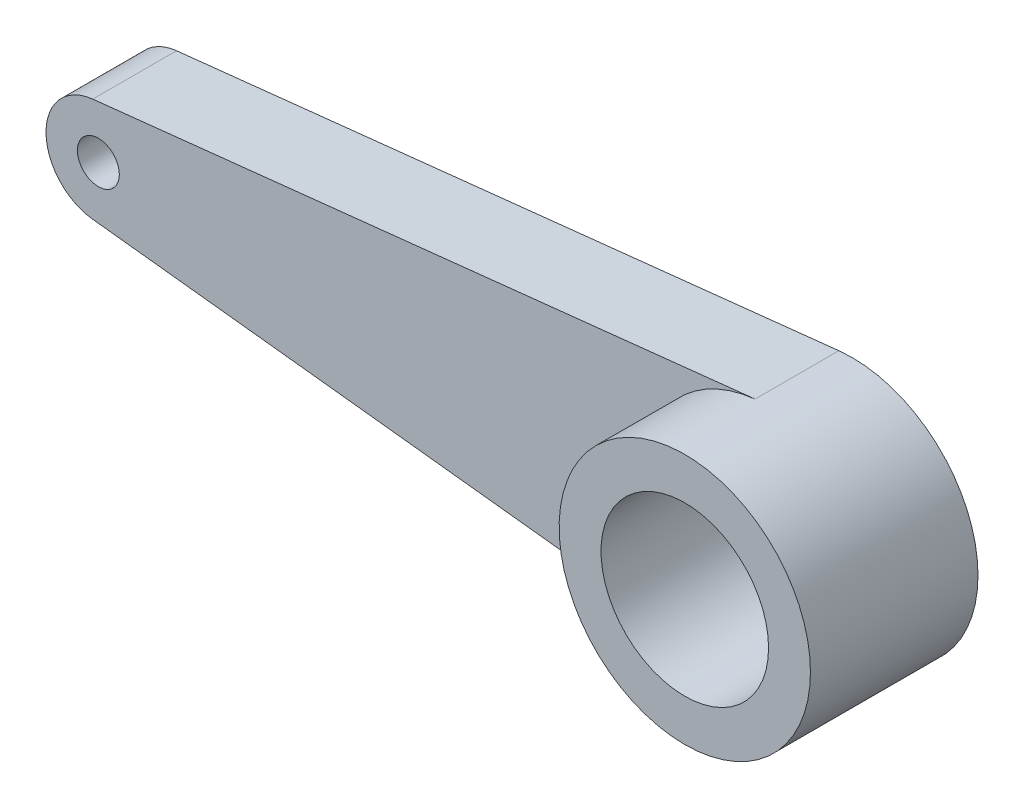
ISO-10303-21;
HEADER;
FILE_DESCRIPTION(('STEP AP214'),'2;1');
FILE_NAME('part.step','',(''),(''),'','','');
FILE_SCHEMA(('AUTOMOTIVE_DESIGN { 1 0 10303 214 1 1 1 1 }'));
ENDSEC;
DATA;
#1=APPLICATION_CONTEXT('core data for automotive mechanical design processes');
#2=APPLICATION_PROTOCOL_DEFINITION('international standard','automotive_design',2000,#1);
#3=PRODUCT_CONTEXT('',#1,'mechanical');
#4=PRODUCT('Part','Part','',(#3));
#5=PRODUCT_RELATED_PRODUCT_CATEGORY('part','',(#4));
#6=PRODUCT_DEFINITION_FORMATION('','',#4);
#7=PRODUCT_DEFINITION_CONTEXT('part definition',#1,'design');
#8=PRODUCT_DEFINITION('design','',#6,#7);
#9=PRODUCT_DEFINITION_SHAPE('','',#8);
#10=(LENGTH_UNIT() NAMED_UNIT(*) SI_UNIT(.MILLI.,.METRE.));
#11=(NAMED_UNIT(*) PLANE_ANGLE_UNIT() SI_UNIT($,.RADIAN.));
#12=(NAMED_UNIT(*) SI_UNIT($,.STERADIAN.) SOLID_ANGLE_UNIT());
#13=UNCERTAINTY_MEASURE_WITH_UNIT(LENGTH_MEASURE(1.E-05),#10,'distance_accuracy_value','');
#14=(GEOMETRIC_REPRESENTATION_CONTEXT(3) GLOBAL_UNCERTAINTY_ASSIGNED_CONTEXT((#13)) GLOBAL_UNIT_ASSIGNED_CONTEXT((#10,
#11,#12)) REPRESENTATION_CONTEXT('',''));
#15=CARTESIAN_POINT('',(0.,0.,0.));
#16=DIRECTION('',(0.,0.,1.));
#17=DIRECTION('',(1.,0.,0.));
#18=AXIS2_PLACEMENT_3D('',#15,#16,#17);
#19=CARTESIAN_POINT('',(0.,0.,4.));
#20=DIRECTION('',(0.,0.,-1.));
#21=DIRECTION('',(-1.,0.,0.));
#22=AXIS2_PLACEMENT_3D('',#19,#20,#21);
#23=CYLINDRICAL_SURFACE('',#22,3.);
#24=CARTESIAN_POINT('',(0.,0.,4.));
#25=DIRECTION('',(0.,0.,1.));
#26=DIRECTION('',(1.,0.,0.));
#27=AXIS2_PLACEMENT_3D('',#24,#25,#26);
#28=CIRCLE('',#27,3.);
#29=CARTESIAN_POINT('',(3.,0.,4.));
#30=VERTEX_POINT('',#29);
#31=EDGE_CURVE('E11',#30,#30,#28,.T.);
#32=ORIENTED_EDGE('',*,*,#31,.F.);
#33=EDGE_LOOP('',(#32));
#34=FACE_BOUND('',#33,.T.);
#35=DIRECTION('',(0.,0.,-1.));
#36=VECTOR('',#35,1.);
#37=CARTESIAN_POINT('',(-0.321491523372577,2.98272412408516,2.));
#38=LINE('',#37,#36);
#39=CARTESIAN_POINT('',(-0.321491523372577,2.98272412408516,2.));
#40=VERTEX_POINT('',#39);
#41=CARTESIAN_POINT('',(-0.321491523372577,2.98272412408516,0.));
#42=VERTEX_POINT('',#41);
#43=EDGE_CURVE('E62',#40,#42,#38,.T.);
#44=ORIENTED_EDGE('',*,*,#43,.F.);
#45=CARTESIAN_POINT('',(0.,0.,2.));
#46=DIRECTION('',(0.,0.,1.));
#47=DIRECTION('',(1.,0.,0.));
#48=AXIS2_PLACEMENT_3D('',#45,#46,#47);
#49=CIRCLE('',#48,3.);
#50=CARTESIAN_POINT('',(-0.334755230815125,-2.98126465370686,2.));
#51=VERTEX_POINT('',#50);
#52=EDGE_CURVE('E57',#40,#51,#49,.T.);
#53=ORIENTED_EDGE('',*,*,#52,.T.);
#54=DIRECTION('',(0.,0.,-1.));
#55=VECTOR('',#54,1.);
#56=CARTESIAN_POINT('',(-0.334755230815125,-2.98126465370686,2.));
#57=LINE('',#56,#55);
#58=CARTESIAN_POINT('',(-0.334755230815125,-2.98126465370686,0.));
#59=VERTEX_POINT('',#58);
#60=EDGE_CURVE('E132',#51,#59,#57,.T.);
#61=ORIENTED_EDGE('',*,*,#60,.T.);
#62=CARTESIAN_POINT('',(0.,0.,0.));
#63=DIRECTION('',(0.,0.,1.));
#64=DIRECTION('',(1.,0.,0.));
#65=AXIS2_PLACEMENT_3D('',#62,#63,#64);
#66=CIRCLE('',#65,3.);
#67=EDGE_CURVE('E43',#59,#42,#66,.T.);
#68=ORIENTED_EDGE('',*,*,#67,.T.);
#69=EDGE_LOOP('',(#44,#53,#61,#68));
#70=FACE_BOUND('',#69,.T.);
#71=ADVANCED_FACE('F39',(#34,#70),#23,.T.);
#72=CARTESIAN_POINT('',(0.,0.,4.));
#73=DIRECTION('',(0.,0.,-1.));
#74=DIRECTION('',(-1.,0.,0.));
#75=AXIS2_PLACEMENT_3D('',#72,#73,#74);
#76=CYLINDRICAL_SURFACE('',#75,2.);
#77=CARTESIAN_POINT('',(0.,0.,4.));
#78=DIRECTION('',(0.,0.,1.));
#79=DIRECTION('',(1.,0.,0.));
#80=AXIS2_PLACEMENT_3D('',#77,#78,#79);
#81=CIRCLE('',#80,2.);
#82=CARTESIAN_POINT('',(2.,0.,4.));
#83=VERTEX_POINT('',#82);
#84=EDGE_CURVE('E49',#83,#83,#81,.T.);
#85=ORIENTED_EDGE('',*,*,#84,.T.);
#86=EDGE_LOOP('',(#85));
#87=FACE_BOUND('',#86,.T.);
#88=CARTESIAN_POINT('',(0.,0.,0.));
#89=DIRECTION('',(0.,0.,1.));
#90=DIRECTION('',(1.,0.,0.));
#91=AXIS2_PLACEMENT_3D('',#88,#89,#90);
#92=CIRCLE('',#91,2.);
#93=CARTESIAN_POINT('',(2.,0.,0.));
#94=VERTEX_POINT('',#93);
#95=EDGE_CURVE('E93',#94,#94,#92,.T.);
#96=ORIENTED_EDGE('',*,*,#95,.F.);
#97=EDGE_LOOP('',(#96));
#98=FACE_BOUND('',#97,.T.);
#99=ADVANCED_FACE('F41',(#87,#98),#76,.F.);
#100=CARTESIAN_POINT('',(0.,0.,4.));
#101=DIRECTION('',(0.,0.,1.));
#102=DIRECTION('',(1.,0.,0.));
#103=AXIS2_PLACEMENT_3D('',#100,#101,#102);
#104=PLANE('',#103);
#105=ORIENTED_EDGE('',*,*,#84,.F.);
#106=EDGE_LOOP('',(#105));
#107=FACE_BOUND('',#106,.T.);
#108=ORIENTED_EDGE('',*,*,#31,.T.);
#109=EDGE_LOOP('',(#108));
#110=FACE_BOUND('',#109,.T.);
#111=ADVANCED_FACE('F166',(#107,#110),#104,.T.);
#112=CARTESIAN_POINT('',(0.,0.,0.));
#113=DIRECTION('',(0.,0.,1.));
#114=DIRECTION('',(1.,0.,0.));
#115=AXIS2_PLACEMENT_3D('',#112,#113,#114);
#116=PLANE('',#115);
#117=ORIENTED_EDGE('',*,*,#95,.T.);
#118=EDGE_LOOP('',(#117));
#119=FACE_BOUND('',#118,.T.);
#120=ORIENTED_EDGE('',*,*,#67,.F.);
#121=DIRECTION('',(0.993754884568955,-0.111585076938375,0.));
#122=VECTOR('',#121,1.);
#123=CARTESIAN_POINT('',(-0.334755230815125,-2.98126465370686,0.));
#124=LINE('',#123,#122);
#125=CARTESIAN_POINT('',(-16.139481346173,-1.20661015192084,0.));
#126=VERTEX_POINT('',#125);
#127=EDGE_CURVE('E111',#126,#59,#124,.T.);
#128=ORIENTED_EDGE('',*,*,#127,.F.);
#129=CARTESIAN_POINT('',(-16.,0.0355834537903587,0.));
#130=DIRECTION('',(0.,0.,1.));
#131=DIRECTION('',(1.,0.,0.));
#132=AXIS2_PLACEMENT_3D('',#129,#130,#131);
#133=CIRCLE('',#132,1.25);
#134=CARTESIAN_POINT('',(-16.1339548014052,1.27838517215917,0.));
#135=VERTEX_POINT('',#134);
#136=EDGE_CURVE('E124',#135,#126,#133,.T.);
#137=ORIENTED_EDGE('',*,*,#136,.F.);
#138=DIRECTION('',(0.994241374695053,0.107163841124192,0.));
#139=VECTOR('',#138,1.);
#140=CARTESIAN_POINT('',(-0.321491523372577,2.98272412408516,0.));
#141=LINE('',#140,#139);
#142=EDGE_CURVE('E88',#135,#42,#141,.T.);
#143=ORIENTED_EDGE('',*,*,#142,.T.);
#144=EDGE_LOOP('',(#120,#128,#137,#143));
#145=FACE_BOUND('',#144,.T.);
#146=CARTESIAN_POINT('',(-16.,0.0355834537903587,0.));
#147=DIRECTION('',(0.,0.,1.));
#148=DIRECTION('',(1.,0.,0.));
#149=AXIS2_PLACEMENT_3D('',#146,#147,#148);
#150=CIRCLE('',#149,0.500000000000001);
#151=CARTESIAN_POINT('',(-15.5,0.0355834537903587,0.));
#152=VERTEX_POINT('',#151);
#153=EDGE_CURVE('E118',#152,#152,#150,.T.);
#154=ORIENTED_EDGE('',*,*,#153,.T.);
#155=EDGE_LOOP('',(#154));
#156=FACE_BOUND('',#155,.T.);
#157=ADVANCED_FACE('F146',(#119,#145,#156),#116,.F.);
#158=CARTESIAN_POINT('',(-0.321491523372577,2.98272412408516,2.));
#159=DIRECTION('',(-0.107163841124192,0.994241374695053,0.));
#160=DIRECTION('',(-0.994241374695053,-0.107163841124192,0.));
#161=AXIS2_PLACEMENT_3D('',#158,#159,#160);
#162=PLANE('',#161);
#163=ORIENTED_EDGE('',*,*,#142,.F.);
#164=DIRECTION('',(0.,0.,-1.));
#165=VECTOR('',#164,1.);
#166=CARTESIAN_POINT('',(-16.1339548014052,1.27838517215917,2.));
#167=LINE('',#166,#165);
#168=CARTESIAN_POINT('',(-16.1339548014052,1.27838517215917,2.));
#169=VERTEX_POINT('',#168);
#170=EDGE_CURVE('E82',#169,#135,#167,.T.);
#171=ORIENTED_EDGE('',*,*,#170,.F.);
#172=DIRECTION('',(0.994241374695053,0.107163841124192,0.));
#173=VECTOR('',#172,1.);
#174=CARTESIAN_POINT('',(-0.321491523372577,2.98272412408516,2.));
#175=LINE('',#174,#173);
#176=EDGE_CURVE('E86',#169,#40,#175,.T.);
#177=ORIENTED_EDGE('',*,*,#176,.T.);
#178=ORIENTED_EDGE('',*,*,#43,.T.);
#179=EDGE_LOOP('',(#163,#171,#177,#178));
#180=FACE_BOUND('',#179,.T.);
#181=ADVANCED_FACE('F84',(#180),#162,.T.);
#182=CARTESIAN_POINT('',(-16.,0.0355834537903587,2.));
#183=DIRECTION('',(0.,0.,-1.));
#184=DIRECTION('',(-1.,0.,0.));
#185=AXIS2_PLACEMENT_3D('',#182,#183,#184);
#186=CYLINDRICAL_SURFACE('',#185,1.25);
#187=ORIENTED_EDGE('',*,*,#136,.T.);
#188=DIRECTION('',(0.,0.,-1.));
#189=VECTOR('',#188,1.);
#190=CARTESIAN_POINT('',(-16.139481346173,-1.20661015192084,2.));
#191=LINE('',#190,#189);
#192=CARTESIAN_POINT('',(-16.139481346173,-1.20661015192084,2.));
#193=VERTEX_POINT('',#192);
#194=EDGE_CURVE('E94',#193,#126,#191,.T.);
#195=ORIENTED_EDGE('',*,*,#194,.F.);
#196=CARTESIAN_POINT('',(-16.,0.0355834537903587,2.));
#197=DIRECTION('',(0.,0.,1.));
#198=DIRECTION('',(1.,0.,0.));
#199=AXIS2_PLACEMENT_3D('',#196,#197,#198);
#200=CIRCLE('',#199,1.25);
#201=EDGE_CURVE('E98',#169,#193,#200,.T.);
#202=ORIENTED_EDGE('',*,*,#201,.F.);
#203=ORIENTED_EDGE('',*,*,#170,.T.);
#204=EDGE_LOOP('',(#187,#195,#202,#203));
#205=FACE_BOUND('',#204,.T.);
#206=ADVANCED_FACE('F99',(#205),#186,.T.);
#207=CARTESIAN_POINT('',(-0.334755230815125,-2.98126465370686,2.));
#208=DIRECTION('',(0.111585076938375,0.993754884568955,0.));
#209=DIRECTION('',(-0.993754884568955,0.111585076938375,0.));
#210=AXIS2_PLACEMENT_3D('',#207,#208,#209);
#211=PLANE('',#210);
#212=ORIENTED_EDGE('',*,*,#127,.T.);
#213=ORIENTED_EDGE('',*,*,#60,.F.);
#214=DIRECTION('',(0.993754884568955,-0.111585076938375,0.));
#215=VECTOR('',#214,1.);
#216=CARTESIAN_POINT('',(-0.334755230815125,-2.98126465370686,2.));
#217=LINE('',#216,#215);
#218=EDGE_CURVE('E103',#193,#51,#217,.T.);
#219=ORIENTED_EDGE('',*,*,#218,.F.);
#220=ORIENTED_EDGE('',*,*,#194,.T.);
#221=EDGE_LOOP('',(#212,#213,#219,#220));
#222=FACE_BOUND('',#221,.T.);
#223=ADVANCED_FACE('F149',(#222),#211,.F.);
#224=CARTESIAN_POINT('',(-16.,0.0355834537903587,2.));
#225=DIRECTION('',(0.,0.,-1.));
#226=DIRECTION('',(-1.,0.,0.));
#227=AXIS2_PLACEMENT_3D('',#224,#225,#226);
#228=CYLINDRICAL_SURFACE('',#227,0.500000000000001);
#229=CARTESIAN_POINT('',(-16.,0.0355834537903587,2.));
#230=DIRECTION('',(0.,0.,1.));
#231=DIRECTION('',(1.,0.,0.));
#232=AXIS2_PLACEMENT_3D('',#229,#230,#231);
#233=CIRCLE('',#232,0.500000000000001);
#234=CARTESIAN_POINT('',(-15.5,0.0355834537903587,2.));
#235=VERTEX_POINT('',#234);
#236=EDGE_CURVE('E107',#235,#235,#233,.T.);
#237=ORIENTED_EDGE('',*,*,#236,.T.);
#238=EDGE_LOOP('',(#237));
#239=FACE_BOUND('',#238,.T.);
#240=ORIENTED_EDGE('',*,*,#153,.F.);
#241=EDGE_LOOP('',(#240));
#242=FACE_BOUND('',#241,.T.);
#243=ADVANCED_FACE('F151',(#239,#242),#228,.F.);
#244=CARTESIAN_POINT('',(0.,0.,2.));
#245=DIRECTION('',(0.,0.,1.));
#246=DIRECTION('',(1.,0.,0.));
#247=AXIS2_PLACEMENT_3D('',#244,#245,#246);
#248=PLANE('',#247);
#249=ORIENTED_EDGE('',*,*,#236,.F.);
#250=EDGE_LOOP('',(#249));
#251=FACE_BOUND('',#250,.T.);
#252=ORIENTED_EDGE('',*,*,#176,.F.);
#253=ORIENTED_EDGE('',*,*,#201,.T.);
#254=ORIENTED_EDGE('',*,*,#218,.T.);
#255=ORIENTED_EDGE('',*,*,#52,.F.);
#256=EDGE_LOOP('',(#252,#253,#254,#255));
#257=FACE_BOUND('',#256,.T.);
#258=ADVANCED_FACE('F105',(#251,#257),#248,.T.);
#259=CLOSED_SHELL('',(#71,#99,#111,#157,#181,#206,#223,#243,#258));
#260=MANIFOLD_SOLID_BREP('B2',#259);
#261=ADVANCED_BREP_SHAPE_REPRESENTATION('',(#18,#260),#14);
#262=SHAPE_DEFINITION_REPRESENTATION(#9,#261);
ENDSEC;
END-ISO-10303-21;
